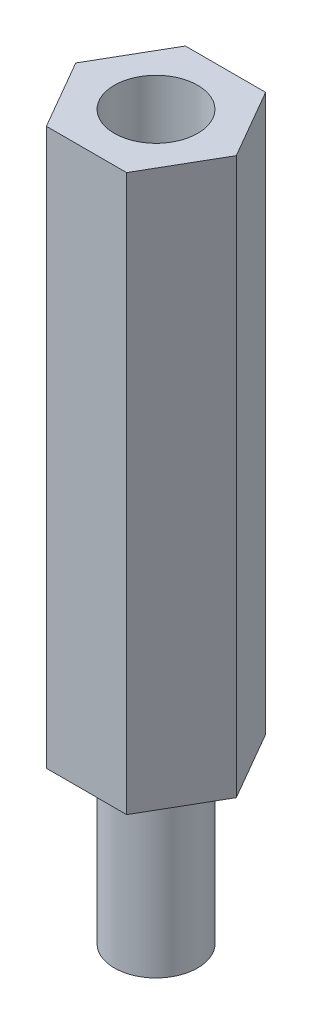
ISO-10303-21;
HEADER;
FILE_DESCRIPTION(('STEP AP214'),'2;1');
FILE_NAME('part.step','',(''),(''),'','','');
FILE_SCHEMA(('AUTOMOTIVE_DESIGN { 1 0 10303 214 1 1 1 1 }'));
ENDSEC;
DATA;
#1=APPLICATION_CONTEXT('core data for automotive mechanical design processes');
#2=APPLICATION_PROTOCOL_DEFINITION('international standard','automotive_design',2000,#1);
#3=PRODUCT_CONTEXT('',#1,'mechanical');
#4=PRODUCT('Part','Part','',(#3));
#5=PRODUCT_RELATED_PRODUCT_CATEGORY('part','',(#4));
#6=PRODUCT_DEFINITION_FORMATION('','',#4);
#7=PRODUCT_DEFINITION_CONTEXT('part definition',#1,'design');
#8=PRODUCT_DEFINITION('design','',#6,#7);
#9=PRODUCT_DEFINITION_SHAPE('','',#8);
#10=(LENGTH_UNIT() NAMED_UNIT(*) SI_UNIT(.MILLI.,.METRE.));
#11=(NAMED_UNIT(*) PLANE_ANGLE_UNIT() SI_UNIT($,.RADIAN.));
#12=(NAMED_UNIT(*) SI_UNIT($,.STERADIAN.) SOLID_ANGLE_UNIT());
#13=UNCERTAINTY_MEASURE_WITH_UNIT(LENGTH_MEASURE(1.E-05),#10,'distance_accuracy_value','');
#14=(GEOMETRIC_REPRESENTATION_CONTEXT(3) GLOBAL_UNCERTAINTY_ASSIGNED_CONTEXT((#13)) GLOBAL_UNIT_ASSIGNED_CONTEXT((#10,
#11,#12)) REPRESENTATION_CONTEXT('',''));
#15=CARTESIAN_POINT('',(0.,0.,0.));
#16=DIRECTION('',(0.,0.,1.));
#17=DIRECTION('',(1.,0.,0.));
#18=AXIS2_PLACEMENT_3D('',#15,#16,#17);
#19=CARTESIAN_POINT('',(0.,-6.,0.));
#20=DIRECTION('',(0.,1.,0.));
#21=DIRECTION('',(0.,0.,1.));
#22=AXIS2_PLACEMENT_3D('',#19,#20,#21);
#23=CYLINDRICAL_SURFACE('',#22,1.5);
#24=CARTESIAN_POINT('',(0.,-6.,0.));
#25=DIRECTION('',(0.,-1.,0.));
#26=DIRECTION('',(0.,0.,-1.));
#27=AXIS2_PLACEMENT_3D('',#24,#25,#26);
#28=CIRCLE('',#27,1.5);
#29=CARTESIAN_POINT('',(0.,-6.,-1.5));
#30=VERTEX_POINT('',#29);
#31=EDGE_CURVE('E11',#30,#30,#28,.T.);
#32=ORIENTED_EDGE('',*,*,#31,.F.);
#33=EDGE_LOOP('',(#32));
#34=FACE_BOUND('',#33,.T.);
#35=CARTESIAN_POINT('',(0.,0.,0.));
#36=DIRECTION('',(0.,-1.,0.));
#37=DIRECTION('',(0.,0.,-1.));
#38=AXIS2_PLACEMENT_3D('',#35,#36,#37);
#39=CIRCLE('',#38,1.5);
#40=CARTESIAN_POINT('',(0.,0.,-1.5));
#41=VERTEX_POINT('',#40);
#42=EDGE_CURVE('E48',#41,#41,#39,.T.);
#43=ORIENTED_EDGE('',*,*,#42,.T.);
#44=EDGE_LOOP('',(#43));
#45=FACE_BOUND('',#44,.T.);
#46=ADVANCED_FACE('F45',(#34,#45),#23,.T.);
#47=CARTESIAN_POINT('',(0.,-6.,0.));
#48=DIRECTION('',(0.,-1.,0.));
#49=DIRECTION('',(0.,0.,-1.));
#50=AXIS2_PLACEMENT_3D('',#47,#48,#49);
#51=PLANE('',#50);
#52=ORIENTED_EDGE('',*,*,#31,.T.);
#53=EDGE_LOOP('',(#52));
#54=FACE_BOUND('',#53,.T.);
#55=ADVANCED_FACE('F60',(#54),#51,.T.);
#56=CARTESIAN_POINT('',(0.,0.,0.));
#57=DIRECTION('',(0.,-1.,0.));
#58=DIRECTION('',(0.,0.,-1.));
#59=AXIS2_PLACEMENT_3D('',#56,#57,#58);
#60=PLANE('',#59);
#61=ORIENTED_EDGE('',*,*,#42,.F.);
#62=EDGE_LOOP('',(#61));
#63=FACE_BOUND('',#62,.T.);
#64=ADVANCED_FACE('F58',(#63),#60,.F.);
#65=CLOSED_SHELL('',(#46,#55,#64));
#66=MANIFOLD_SOLID_BREP('B2',#65);
#67=CARTESIAN_POINT('',(0.,20.,0.));
#68=DIRECTION('',(0.,1.,0.));
#69=DIRECTION('',(0.,0.,1.));
#70=AXIS2_PLACEMENT_3D('',#67,#68,#69);
#71=PLANE('',#70);
#72=DIRECTION('',(1.,0.,0.));
#73=VECTOR('',#72,1.);
#74=CARTESIAN_POINT('',(-1.44337567297405,20.,2.5));
#75=LINE('',#74,#73);
#76=CARTESIAN_POINT('',(-1.44337567297405,20.,2.5));
#77=VERTEX_POINT('',#76);
#78=CARTESIAN_POINT('',(1.44337567297408,20.,2.5));
#79=VERTEX_POINT('',#78);
#80=EDGE_CURVE('E176',#77,#79,#75,.T.);
#81=ORIENTED_EDGE('',*,*,#80,.T.);
#82=DIRECTION('',(0.500000000000001,0.,-0.866025403784438));
#83=VECTOR('',#82,1.);
#84=CARTESIAN_POINT('',(1.44337567297408,20.,2.5));
#85=LINE('',#84,#83);
#86=CARTESIAN_POINT('',(2.88675134594815,20.,0.));
#87=VERTEX_POINT('',#86);
#88=EDGE_CURVE('E134',#79,#87,#85,.T.);
#89=ORIENTED_EDGE('',*,*,#88,.T.);
#90=DIRECTION('',(-0.500000000000001,0.,-0.866025403784438));
#91=VECTOR('',#90,1.);
#92=CARTESIAN_POINT('',(2.88675134594815,20.,0.));
#93=LINE('',#92,#91);
#94=CARTESIAN_POINT('',(1.44337567297408,20.,-2.50000000000001));
#95=VERTEX_POINT('',#94);
#96=EDGE_CURVE('E147',#87,#95,#93,.T.);
#97=ORIENTED_EDGE('',*,*,#96,.T.);
#98=DIRECTION('',(-1.,0.,0.));
#99=VECTOR('',#98,1.);
#100=CARTESIAN_POINT('',(1.44337567297408,20.,-2.50000000000001));
#101=LINE('',#100,#99);
#102=CARTESIAN_POINT('',(-1.44337567297405,20.,-2.50000000000001));
#103=VERTEX_POINT('',#102);
#104=EDGE_CURVE('E141',#95,#103,#101,.T.);
#105=ORIENTED_EDGE('',*,*,#104,.T.);
#106=DIRECTION('',(-0.5,0.,0.866025403784438));
#107=VECTOR('',#106,1.);
#108=CARTESIAN_POINT('',(-1.44337567297405,20.,-2.50000000000001));
#109=LINE('',#108,#107);
#110=CARTESIAN_POINT('',(-2.88675134594812,20.,0.));
#111=VERTEX_POINT('',#110);
#112=EDGE_CURVE('E145',#103,#111,#109,.T.);
#113=ORIENTED_EDGE('',*,*,#112,.T.);
#114=DIRECTION('',(0.5,0.,0.866025403784438));
#115=VECTOR('',#114,1.);
#116=CARTESIAN_POINT('',(-2.88675134594812,20.,0.));
#117=LINE('',#116,#115);
#118=EDGE_CURVE('E97',#111,#77,#117,.T.);
#119=ORIENTED_EDGE('',*,*,#118,.T.);
#120=EDGE_LOOP('',(#81,#89,#97,#105,#113,#119));
#121=FACE_BOUND('',#120,.T.);
#122=CARTESIAN_POINT('',(0.,20.,0.));
#123=DIRECTION('',(0.,1.,0.));
#124=DIRECTION('',(0.,0.,1.));
#125=AXIS2_PLACEMENT_3D('',#122,#123,#124);
#126=CIRCLE('',#125,1.5);
#127=CARTESIAN_POINT('',(0.,20.,1.5));
#128=VERTEX_POINT('',#127);
#129=EDGE_CURVE('E169',#128,#128,#126,.T.);
#130=ORIENTED_EDGE('',*,*,#129,.F.);
#131=EDGE_LOOP('',(#130));
#132=FACE_BOUND('',#131,.T.);
#133=ADVANCED_FACE('F80',(#121,#132),#71,.T.);
#134=CARTESIAN_POINT('',(0.,0.,0.));
#135=DIRECTION('',(0.,1.,0.));
#136=DIRECTION('',(0.,0.,1.));
#137=AXIS2_PLACEMENT_3D('',#134,#135,#136);
#138=PLANE('',#137);
#139=DIRECTION('',(1.,0.,0.));
#140=VECTOR('',#139,1.);
#141=CARTESIAN_POINT('',(-1.44337567297405,0.,2.5));
#142=LINE('',#141,#140);
#143=CARTESIAN_POINT('',(-1.44337567297405,0.,2.5));
#144=VERTEX_POINT('',#143);
#145=CARTESIAN_POINT('',(1.44337567297408,0.,2.5));
#146=VERTEX_POINT('',#145);
#147=EDGE_CURVE('E165',#144,#146,#142,.T.);
#148=ORIENTED_EDGE('',*,*,#147,.F.);
#149=DIRECTION('',(0.5,0.,0.866025403784438));
#150=VECTOR('',#149,1.);
#151=CARTESIAN_POINT('',(-2.88675134594812,0.,0.));
#152=LINE('',#151,#150);
#153=CARTESIAN_POINT('',(-2.88675134594812,0.,0.));
#154=VERTEX_POINT('',#153);
#155=EDGE_CURVE('E126',#154,#144,#152,.T.);
#156=ORIENTED_EDGE('',*,*,#155,.F.);
#157=DIRECTION('',(-0.5,0.,0.866025403784438));
#158=VECTOR('',#157,1.);
#159=CARTESIAN_POINT('',(-1.44337567297405,0.,-2.50000000000001));
#160=LINE('',#159,#158);
#161=CARTESIAN_POINT('',(-1.44337567297405,0.,-2.50000000000001));
#162=VERTEX_POINT('',#161);
#163=EDGE_CURVE('E120',#162,#154,#160,.T.);
#164=ORIENTED_EDGE('',*,*,#163,.F.);
#165=DIRECTION('',(-1.,0.,0.));
#166=VECTOR('',#165,1.);
#167=CARTESIAN_POINT('',(1.44337567297408,0.,-2.50000000000001));
#168=LINE('',#167,#166);
#169=CARTESIAN_POINT('',(1.44337567297408,0.,-2.50000000000001));
#170=VERTEX_POINT('',#169);
#171=EDGE_CURVE('E155',#170,#162,#168,.T.);
#172=ORIENTED_EDGE('',*,*,#171,.F.);
#173=DIRECTION('',(-0.500000000000001,0.,-0.866025403784438));
#174=VECTOR('',#173,1.);
#175=CARTESIAN_POINT('',(2.88675134594815,0.,0.));
#176=LINE('',#175,#174);
#177=CARTESIAN_POINT('',(2.88675134594815,0.,0.));
#178=VERTEX_POINT('',#177);
#179=EDGE_CURVE('E171',#178,#170,#176,.T.);
#180=ORIENTED_EDGE('',*,*,#179,.F.);
#181=DIRECTION('',(0.500000000000001,0.,-0.866025403784438));
#182=VECTOR('',#181,1.);
#183=CARTESIAN_POINT('',(1.44337567297408,0.,2.5));
#184=LINE('',#183,#182);
#185=EDGE_CURVE('E168',#146,#178,#184,.T.);
#186=ORIENTED_EDGE('',*,*,#185,.F.);
#187=EDGE_LOOP('',(#148,#156,#164,#172,#180,#186));
#188=FACE_BOUND('',#187,.T.);
#189=CARTESIAN_POINT('',(0.,0.,0.));
#190=DIRECTION('',(0.,1.,0.));
#191=DIRECTION('',(0.,0.,1.));
#192=AXIS2_PLACEMENT_3D('',#189,#190,#191);
#193=CIRCLE('',#192,1.5);
#194=CARTESIAN_POINT('',(0.,0.,1.5));
#195=VERTEX_POINT('',#194);
#196=EDGE_CURVE('E251',#195,#195,#193,.T.);
#197=ORIENTED_EDGE('',*,*,#196,.T.);
#198=EDGE_LOOP('',(#197));
#199=FACE_BOUND('',#198,.T.);
#200=ADVANCED_FACE('F185',(#188,#199),#138,.F.);
#201=CARTESIAN_POINT('',(-1.44337567297405,20.,2.5));
#202=DIRECTION('',(0.,0.,-1.));
#203=DIRECTION('',(-1.,0.,0.));
#204=AXIS2_PLACEMENT_3D('',#201,#202,#203);
#205=PLANE('',#204);
#206=ORIENTED_EDGE('',*,*,#147,.T.);
#207=DIRECTION('',(0.,-1.,0.));
#208=VECTOR('',#207,1.);
#209=CARTESIAN_POINT('',(1.44337567297408,20.,2.5));
#210=LINE('',#209,#208);
#211=EDGE_CURVE('E43',#79,#146,#210,.T.);
#212=ORIENTED_EDGE('',*,*,#211,.F.);
#213=ORIENTED_EDGE('',*,*,#80,.F.);
#214=DIRECTION('',(0.,-1.,0.));
#215=VECTOR('',#214,1.);
#216=CARTESIAN_POINT('',(-1.44337567297405,20.,2.5));
#217=LINE('',#216,#215);
#218=EDGE_CURVE('E161',#77,#144,#217,.T.);
#219=ORIENTED_EDGE('',*,*,#218,.T.);
#220=EDGE_LOOP('',(#206,#212,#213,#219));
#221=FACE_BOUND('',#220,.T.);
#222=ADVANCED_FACE('F82',(#221),#205,.F.);
#223=CARTESIAN_POINT('',(1.44337567297408,20.,2.5));
#224=DIRECTION('',(-0.866025403784438,0.,-0.500000000000001));
#225=DIRECTION('',(-0.500000000000001,0.,0.866025403784438));
#226=AXIS2_PLACEMENT_3D('',#223,#224,#225);
#227=PLANE('',#226);
#228=ORIENTED_EDGE('',*,*,#185,.T.);
#229=DIRECTION('',(0.,-1.,0.));
#230=VECTOR('',#229,1.);
#231=CARTESIAN_POINT('',(2.88675134594815,20.,0.));
#232=LINE('',#231,#230);
#233=EDGE_CURVE('E89',#87,#178,#232,.T.);
#234=ORIENTED_EDGE('',*,*,#233,.F.);
#235=ORIENTED_EDGE('',*,*,#88,.F.);
#236=ORIENTED_EDGE('',*,*,#211,.T.);
#237=EDGE_LOOP('',(#228,#234,#235,#236));
#238=FACE_BOUND('',#237,.T.);
#239=ADVANCED_FACE('F210',(#238),#227,.F.);
#240=CARTESIAN_POINT('',(2.88675134594815,20.,0.));
#241=DIRECTION('',(-0.866025403784438,0.,0.500000000000001));
#242=DIRECTION('',(0.500000000000001,0.,0.866025403784438));
#243=AXIS2_PLACEMENT_3D('',#240,#241,#242);
#244=PLANE('',#243);
#245=ORIENTED_EDGE('',*,*,#179,.T.);
#246=DIRECTION('',(0.,-1.,0.));
#247=VECTOR('',#246,1.);
#248=CARTESIAN_POINT('',(1.44337567297408,20.,-2.50000000000001));
#249=LINE('',#248,#247);
#250=EDGE_CURVE('E156',#95,#170,#249,.T.);
#251=ORIENTED_EDGE('',*,*,#250,.F.);
#252=ORIENTED_EDGE('',*,*,#96,.F.);
#253=ORIENTED_EDGE('',*,*,#233,.T.);
#254=EDGE_LOOP('',(#245,#251,#252,#253));
#255=FACE_BOUND('',#254,.T.);
#256=ADVANCED_FACE('F182',(#255),#244,.F.);
#257=CARTESIAN_POINT('',(1.44337567297408,20.,-2.50000000000001));
#258=DIRECTION('',(0.,0.,1.));
#259=DIRECTION('',(1.,0.,0.));
#260=AXIS2_PLACEMENT_3D('',#257,#258,#259);
#261=PLANE('',#260);
#262=ORIENTED_EDGE('',*,*,#171,.T.);
#263=DIRECTION('',(0.,-1.,0.));
#264=VECTOR('',#263,1.);
#265=CARTESIAN_POINT('',(-1.44337567297405,20.,-2.50000000000001));
#266=LINE('',#265,#264);
#267=EDGE_CURVE('E152',#103,#162,#266,.T.);
#268=ORIENTED_EDGE('',*,*,#267,.F.);
#269=ORIENTED_EDGE('',*,*,#104,.F.);
#270=ORIENTED_EDGE('',*,*,#250,.T.);
#271=EDGE_LOOP('',(#262,#268,#269,#270));
#272=FACE_BOUND('',#271,.T.);
#273=ADVANCED_FACE('F153',(#272),#261,.F.);
#274=CARTESIAN_POINT('',(-1.44337567297405,20.,-2.50000000000001));
#275=DIRECTION('',(0.866025403784439,0.,0.5));
#276=DIRECTION('',(0.5,0.,-0.866025403784439));
#277=AXIS2_PLACEMENT_3D('',#274,#275,#276);
#278=PLANE('',#277);
#279=ORIENTED_EDGE('',*,*,#163,.T.);
#280=DIRECTION('',(0.,-1.,0.));
#281=VECTOR('',#280,1.);
#282=CARTESIAN_POINT('',(-2.88675134594812,20.,0.));
#283=LINE('',#282,#281);
#284=EDGE_CURVE('E157',#111,#154,#283,.T.);
#285=ORIENTED_EDGE('',*,*,#284,.F.);
#286=ORIENTED_EDGE('',*,*,#112,.F.);
#287=ORIENTED_EDGE('',*,*,#267,.T.);
#288=EDGE_LOOP('',(#279,#285,#286,#287));
#289=FACE_BOUND('',#288,.T.);
#290=ADVANCED_FACE('F159',(#289),#278,.F.);
#291=CARTESIAN_POINT('',(-2.88675134594812,20.,0.));
#292=DIRECTION('',(0.866025403784438,0.,-0.5));
#293=DIRECTION('',(-0.5,0.,-0.866025403784438));
#294=AXIS2_PLACEMENT_3D('',#291,#292,#293);
#295=PLANE('',#294);
#296=ORIENTED_EDGE('',*,*,#155,.T.);
#297=ORIENTED_EDGE('',*,*,#218,.F.);
#298=ORIENTED_EDGE('',*,*,#118,.F.);
#299=ORIENTED_EDGE('',*,*,#284,.T.);
#300=EDGE_LOOP('',(#296,#297,#298,#299));
#301=FACE_BOUND('',#300,.T.);
#302=ADVANCED_FACE('F190',(#301),#295,.F.);
#303=CARTESIAN_POINT('',(0.,20.,0.));
#304=DIRECTION('',(0.,-1.,0.));
#305=DIRECTION('',(0.,0.,-1.));
#306=AXIS2_PLACEMENT_3D('',#303,#304,#305);
#307=CYLINDRICAL_SURFACE('',#306,1.5);
#308=ORIENTED_EDGE('',*,*,#129,.T.);
#309=EDGE_LOOP('',(#308));
#310=FACE_BOUND('',#309,.T.);
#311=ORIENTED_EDGE('',*,*,#196,.F.);
#312=EDGE_LOOP('',(#311));
#313=FACE_BOUND('',#312,.T.);
#314=ADVANCED_FACE('F192',(#310,#313),#307,.F.);
#315=CLOSED_SHELL('',(#133,#200,#222,#239,#256,#273,#290,#302,#314));
#316=MANIFOLD_SOLID_BREP('B6',#315);
#317=ADVANCED_BREP_SHAPE_REPRESENTATION('',(#18,#66,#316),#14);
#318=SHAPE_DEFINITION_REPRESENTATION(#9,#317);
ENDSEC;
END-ISO-10303-21;
